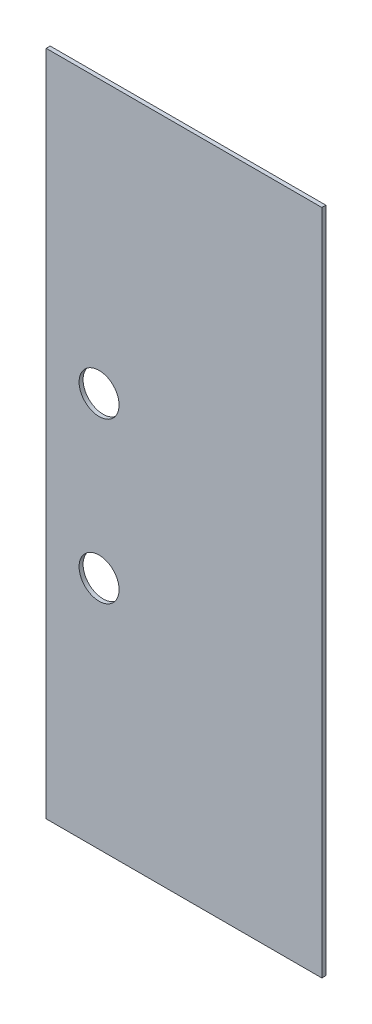
ISO-10303-21;
HEADER;
FILE_DESCRIPTION(('STEP AP214'),'2;1');
FILE_NAME('part.step','',(''),(''),'','','');
FILE_SCHEMA(('AUTOMOTIVE_DESIGN { 1 0 10303 214 1 1 1 1 }'));
ENDSEC;
DATA;
#1=APPLICATION_CONTEXT('core data for automotive mechanical design processes');
#2=APPLICATION_PROTOCOL_DEFINITION('international standard','automotive_design',2000,#1);
#3=PRODUCT_CONTEXT('',#1,'mechanical');
#4=PRODUCT('Part','Part','',(#3));
#5=PRODUCT_RELATED_PRODUCT_CATEGORY('part','',(#4));
#6=PRODUCT_DEFINITION_FORMATION('','',#4);
#7=PRODUCT_DEFINITION_CONTEXT('part definition',#1,'design');
#8=PRODUCT_DEFINITION('design','',#6,#7);
#9=PRODUCT_DEFINITION_SHAPE('','',#8);
#10=(LENGTH_UNIT() NAMED_UNIT(*) SI_UNIT(.MILLI.,.METRE.));
#11=(NAMED_UNIT(*) PLANE_ANGLE_UNIT() SI_UNIT($,.RADIAN.));
#12=(NAMED_UNIT(*) SI_UNIT($,.STERADIAN.) SOLID_ANGLE_UNIT());
#13=UNCERTAINTY_MEASURE_WITH_UNIT(LENGTH_MEASURE(1.E-05),#10,'distance_accuracy_value','');
#14=(GEOMETRIC_REPRESENTATION_CONTEXT(3) GLOBAL_UNCERTAINTY_ASSIGNED_CONTEXT((#13)) GLOBAL_UNIT_ASSIGNED_CONTEXT((#10,
#11,#12)) REPRESENTATION_CONTEXT('',''));
#15=CARTESIAN_POINT('',(0.,0.,0.));
#16=DIRECTION('',(0.,0.,1.));
#17=DIRECTION('',(1.,0.,0.));
#18=AXIS2_PLACEMENT_3D('',#15,#16,#17);
#19=CARTESIAN_POINT('',(104.75,-140.7,-0.045));
#20=DIRECTION('',(0.,0.,-1.));
#21=DIRECTION('',(0.,-1.,0.));
#22=AXIS2_PLACEMENT_3D('',#19,#20,#21);
#23=CYLINDRICAL_SURFACE('',#22,0.175);
#24=CARTESIAN_POINT('',(104.75,-140.7,1.6));
#25=DIRECTION('',(0.,0.,-1.));
#26=DIRECTION('',(0.,-1.,0.));
#27=AXIS2_PLACEMENT_3D('',#24,#25,#26);
#28=CIRCLE('',#27,0.175);
#29=CARTESIAN_POINT('',(104.75,-140.875,1.6));
#30=VERTEX_POINT('',#29);
#31=EDGE_CURVE('E81',#30,#30,#28,.T.);
#32=ORIENTED_EDGE('',*,*,#31,.T.);
#33=DIRECTION('',(0.,0.,1.));
#34=VECTOR('',#33,1.);
#35=CARTESIAN_POINT('',(104.75,-140.875,-0.045));
#36=LINE('',#35,#34);
#37=CARTESIAN_POINT('',(104.75,-140.875,1.635));
#38=VERTEX_POINT('',#37);
#39=EDGE_CURVE('E11',#30,#38,#36,.T.);
#40=ORIENTED_EDGE('',*,*,#39,.T.);
#41=CARTESIAN_POINT('',(104.75,-140.7,1.635));
#42=DIRECTION('',(0.,0.,-1.));
#43=DIRECTION('',(0.,-1.,0.));
#44=AXIS2_PLACEMENT_3D('',#41,#42,#43);
#45=CIRCLE('',#44,0.175);
#46=EDGE_CURVE('E127',#38,#38,#45,.T.);
#47=ORIENTED_EDGE('',*,*,#46,.F.);
#48=ORIENTED_EDGE('',*,*,#39,.F.);
#49=EDGE_LOOP('',(#32,#40,#47,#48));
#50=FACE_BOUND('',#49,.T.);
#51=ADVANCED_FACE('F17',(#50),#23,.F.);
#52=CARTESIAN_POINT('',(104.75,-142.1,-0.045));
#53=DIRECTION('',(0.,0.,-1.));
#54=DIRECTION('',(0.,-1.,0.));
#55=AXIS2_PLACEMENT_3D('',#52,#53,#54);
#56=CYLINDRICAL_SURFACE('',#55,0.175);
#57=CARTESIAN_POINT('',(104.75,-142.1,1.6));
#58=DIRECTION('',(0.,0.,-1.));
#59=DIRECTION('',(0.,-1.,0.));
#60=AXIS2_PLACEMENT_3D('',#57,#58,#59);
#61=CIRCLE('',#60,0.175);
#62=CARTESIAN_POINT('',(104.75,-142.275,1.6));
#63=VERTEX_POINT('',#62);
#64=EDGE_CURVE('E115',#63,#63,#61,.T.);
#65=ORIENTED_EDGE('',*,*,#64,.T.);
#66=DIRECTION('',(0.,0.,1.));
#67=VECTOR('',#66,1.);
#68=CARTESIAN_POINT('',(104.75,-142.275,-0.045));
#69=LINE('',#68,#67);
#70=CARTESIAN_POINT('',(104.75,-142.275,1.635));
#71=VERTEX_POINT('',#70);
#72=EDGE_CURVE('E20',#63,#71,#69,.T.);
#73=ORIENTED_EDGE('',*,*,#72,.T.);
#74=CARTESIAN_POINT('',(104.75,-142.1,1.635));
#75=DIRECTION('',(0.,0.,-1.));
#76=DIRECTION('',(0.,-1.,0.));
#77=AXIS2_PLACEMENT_3D('',#74,#75,#76);
#78=CIRCLE('',#77,0.175);
#79=EDGE_CURVE('E80',#71,#71,#78,.T.);
#80=ORIENTED_EDGE('',*,*,#79,.F.);
#81=ORIENTED_EDGE('',*,*,#72,.F.);
#82=EDGE_LOOP('',(#65,#73,#80,#81));
#83=FACE_BOUND('',#82,.T.);
#84=ADVANCED_FACE('F145',(#83),#56,.F.);
#85=CARTESIAN_POINT('',(104.287,-138.3146,1.6));
#86=DIRECTION('',(0.,1.,0.));
#87=DIRECTION('',(1.,0.,0.));
#88=AXIS2_PLACEMENT_3D('',#85,#86,#87);
#89=PLANE('',#88);
#90=DIRECTION('',(0.,0.,1.));
#91=VECTOR('',#90,1.);
#92=CARTESIAN_POINT('',(104.287,-138.3146,1.6));
#93=LINE('',#92,#91);
#94=CARTESIAN_POINT('',(104.287,-138.3146,1.6));
#95=VERTEX_POINT('',#94);
#96=CARTESIAN_POINT('',(104.287,-138.3146,1.635));
#97=VERTEX_POINT('',#96);
#98=EDGE_CURVE('E84',#95,#97,#93,.T.);
#99=ORIENTED_EDGE('',*,*,#98,.T.);
#100=DIRECTION('',(1.,0.,0.));
#101=VECTOR('',#100,1.);
#102=CARTESIAN_POINT('',(104.287,-138.3146,1.635));
#103=LINE('',#102,#101);
#104=CARTESIAN_POINT('',(106.7,-138.3146,1.635));
#105=VERTEX_POINT('',#104);
#106=EDGE_CURVE('E66',#97,#105,#103,.T.);
#107=ORIENTED_EDGE('',*,*,#106,.T.);
#108=DIRECTION('',(0.,0.,1.));
#109=VECTOR('',#108,1.);
#110=CARTESIAN_POINT('',(106.7,-138.3146,1.6));
#111=LINE('',#110,#109);
#112=CARTESIAN_POINT('',(106.7,-138.3146,1.6));
#113=VERTEX_POINT('',#112);
#114=EDGE_CURVE('E121',#113,#105,#111,.T.);
#115=ORIENTED_EDGE('',*,*,#114,.F.);
#116=DIRECTION('',(1.,0.,0.));
#117=VECTOR('',#116,1.);
#118=CARTESIAN_POINT('',(104.287,-138.3146,1.6));
#119=LINE('',#118,#117);
#120=EDGE_CURVE('E86',#95,#113,#119,.T.);
#121=ORIENTED_EDGE('',*,*,#120,.F.);
#122=EDGE_LOOP('',(#99,#107,#115,#121));
#123=FACE_BOUND('',#122,.T.);
#124=ADVANCED_FACE('F85',(#123),#89,.T.);
#125=CARTESIAN_POINT('',(105.4935,-141.2356,1.635));
#126=DIRECTION('',(0.,0.,-1.));
#127=DIRECTION('',(0.,-1.,0.));
#128=AXIS2_PLACEMENT_3D('',#125,#126,#127);
#129=PLANE('',#128);
#130=ORIENTED_EDGE('',*,*,#46,.T.);
#131=EDGE_LOOP('',(#130));
#132=FACE_BOUND('',#131,.T.);
#133=ORIENTED_EDGE('',*,*,#79,.T.);
#134=EDGE_LOOP('',(#133));
#135=FACE_BOUND('',#134,.T.);
#136=DIRECTION('',(0.,-1.,0.));
#137=VECTOR('',#136,1.);
#138=CARTESIAN_POINT('',(106.7,-138.3146,1.635));
#139=LINE('',#138,#137);
#140=CARTESIAN_POINT('',(106.7,-144.1566,1.635));
#141=VERTEX_POINT('',#140);
#142=EDGE_CURVE('E75',#105,#141,#139,.T.);
#143=ORIENTED_EDGE('',*,*,#142,.F.);
#144=ORIENTED_EDGE('',*,*,#106,.F.);
#145=DIRECTION('',(0.,1.,0.));
#146=VECTOR('',#145,1.);
#147=CARTESIAN_POINT('',(104.287,-144.1566,1.635));
#148=LINE('',#147,#146);
#149=CARTESIAN_POINT('',(104.287,-144.1566,1.635));
#150=VERTEX_POINT('',#149);
#151=EDGE_CURVE('E72',#150,#97,#148,.T.);
#152=ORIENTED_EDGE('',*,*,#151,.F.);
#153=DIRECTION('',(-1.,0.,0.));
#154=VECTOR('',#153,1.);
#155=CARTESIAN_POINT('',(106.7,-144.1566,1.635));
#156=LINE('',#155,#154);
#157=EDGE_CURVE('E110',#141,#150,#156,.T.);
#158=ORIENTED_EDGE('',*,*,#157,.F.);
#159=EDGE_LOOP('',(#143,#144,#152,#158));
#160=FACE_BOUND('',#159,.T.);
#161=ADVANCED_FACE('F68',(#132,#135,#160),#129,.F.);
#162=CARTESIAN_POINT('',(105.4935,-141.2356,1.6));
#163=DIRECTION('',(0.,0.,-1.));
#164=DIRECTION('',(0.,-1.,0.));
#165=AXIS2_PLACEMENT_3D('',#162,#163,#164);
#166=PLANE('',#165);
#167=ORIENTED_EDGE('',*,*,#31,.F.);
#168=EDGE_LOOP('',(#167));
#169=FACE_BOUND('',#168,.T.);
#170=ORIENTED_EDGE('',*,*,#64,.F.);
#171=EDGE_LOOP('',(#170));
#172=FACE_BOUND('',#171,.T.);
#173=DIRECTION('',(-1.,0.,0.));
#174=VECTOR('',#173,1.);
#175=CARTESIAN_POINT('',(106.7,-144.1566,1.6));
#176=LINE('',#175,#174);
#177=CARTESIAN_POINT('',(106.7,-144.1566,1.6));
#178=VERTEX_POINT('',#177);
#179=CARTESIAN_POINT('',(104.287,-144.1566,1.6));
#180=VERTEX_POINT('',#179);
#181=EDGE_CURVE('E118',#178,#180,#176,.T.);
#182=ORIENTED_EDGE('',*,*,#181,.T.);
#183=DIRECTION('',(0.,1.,0.));
#184=VECTOR('',#183,1.);
#185=CARTESIAN_POINT('',(104.287,-144.1566,1.6));
#186=LINE('',#185,#184);
#187=EDGE_CURVE('E91',#180,#95,#186,.T.);
#188=ORIENTED_EDGE('',*,*,#187,.T.);
#189=ORIENTED_EDGE('',*,*,#120,.T.);
#190=DIRECTION('',(0.,-1.,0.));
#191=VECTOR('',#190,1.);
#192=CARTESIAN_POINT('',(106.7,-138.3146,1.6));
#193=LINE('',#192,#191);
#194=EDGE_CURVE('E98',#113,#178,#193,.T.);
#195=ORIENTED_EDGE('',*,*,#194,.T.);
#196=EDGE_LOOP('',(#182,#188,#189,#195));
#197=FACE_BOUND('',#196,.T.);
#198=ADVANCED_FACE('F149',(#169,#172,#197),#166,.T.);
#199=CARTESIAN_POINT('',(104.287,-144.1566,1.6));
#200=DIRECTION('',(-1.,0.,0.));
#201=DIRECTION('',(0.,0.,1.));
#202=AXIS2_PLACEMENT_3D('',#199,#200,#201);
#203=PLANE('',#202);
#204=DIRECTION('',(0.,0.,1.));
#205=VECTOR('',#204,1.);
#206=CARTESIAN_POINT('',(104.287,-144.1566,1.6));
#207=LINE('',#206,#205);
#208=EDGE_CURVE('E95',#180,#150,#207,.T.);
#209=ORIENTED_EDGE('',*,*,#208,.T.);
#210=ORIENTED_EDGE('',*,*,#151,.T.);
#211=ORIENTED_EDGE('',*,*,#98,.F.);
#212=ORIENTED_EDGE('',*,*,#187,.F.);
#213=EDGE_LOOP('',(#209,#210,#211,#212));
#214=FACE_BOUND('',#213,.T.);
#215=ADVANCED_FACE('F93',(#214),#203,.T.);
#216=CARTESIAN_POINT('',(106.7,-138.3146,1.6));
#217=DIRECTION('',(1.,0.,0.));
#218=DIRECTION('',(0.,1.,0.));
#219=AXIS2_PLACEMENT_3D('',#216,#217,#218);
#220=PLANE('',#219);
#221=ORIENTED_EDGE('',*,*,#114,.T.);
#222=ORIENTED_EDGE('',*,*,#142,.T.);
#223=DIRECTION('',(0.,0.,1.));
#224=VECTOR('',#223,1.);
#225=CARTESIAN_POINT('',(106.7,-144.1566,1.6));
#226=LINE('',#225,#224);
#227=EDGE_CURVE('E107',#178,#141,#226,.T.);
#228=ORIENTED_EDGE('',*,*,#227,.F.);
#229=ORIENTED_EDGE('',*,*,#194,.F.);
#230=EDGE_LOOP('',(#221,#222,#228,#229));
#231=FACE_BOUND('',#230,.T.);
#232=ADVANCED_FACE('F220',(#231),#220,.T.);
#233=CARTESIAN_POINT('',(106.7,-144.1566,1.6));
#234=DIRECTION('',(0.,-1.,0.));
#235=DIRECTION('',(0.,0.,-1.));
#236=AXIS2_PLACEMENT_3D('',#233,#234,#235);
#237=PLANE('',#236);
#238=ORIENTED_EDGE('',*,*,#227,.T.);
#239=ORIENTED_EDGE('',*,*,#157,.T.);
#240=ORIENTED_EDGE('',*,*,#208,.F.);
#241=ORIENTED_EDGE('',*,*,#181,.F.);
#242=EDGE_LOOP('',(#238,#239,#240,#241));
#243=FACE_BOUND('',#242,.T.);
#244=ADVANCED_FACE('F174',(#243),#237,.T.);
#245=CLOSED_SHELL('',(#51,#84,#124,#161,#198,#215,#232,#244));
#246=MANIFOLD_SOLID_BREP('B1',#245);
#247=ADVANCED_BREP_SHAPE_REPRESENTATION('',(#18,#246),#14);
#248=SHAPE_DEFINITION_REPRESENTATION(#9,#247);
ENDSEC;
END-ISO-10303-21;
